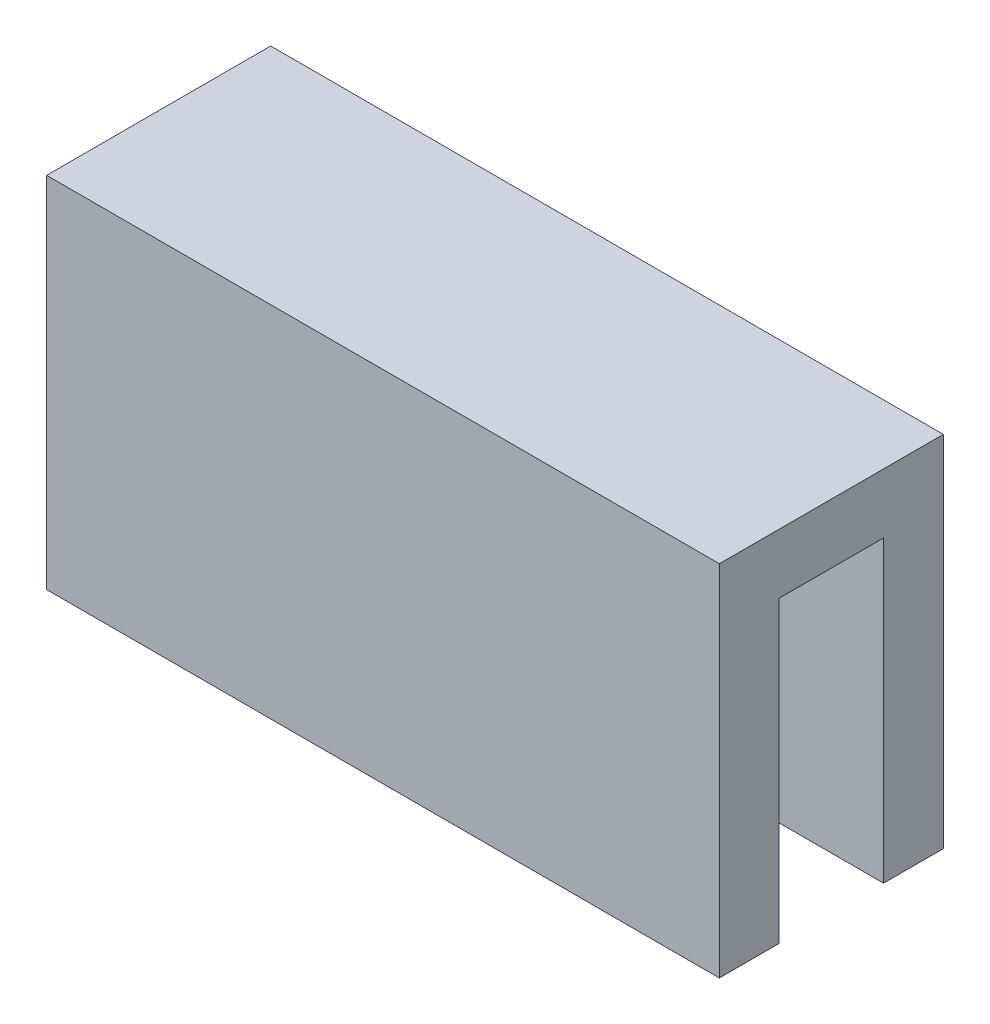
ISO-10303-21;
HEADER;
FILE_DESCRIPTION(('STEP AP214'),'2;1');
FILE_NAME('part.step','',(''),(''),'','','');
FILE_SCHEMA(('AUTOMOTIVE_DESIGN { 1 0 10303 214 1 1 1 1 }'));
ENDSEC;
DATA;
#1=APPLICATION_CONTEXT('core data for automotive mechanical design processes');
#2=APPLICATION_PROTOCOL_DEFINITION('international standard','automotive_design',2000,#1);
#3=PRODUCT_CONTEXT('',#1,'mechanical');
#4=PRODUCT('Part','Part','',(#3));
#5=PRODUCT_RELATED_PRODUCT_CATEGORY('part','',(#4));
#6=PRODUCT_DEFINITION_FORMATION('','',#4);
#7=PRODUCT_DEFINITION_CONTEXT('part definition',#1,'design');
#8=PRODUCT_DEFINITION('design','',#6,#7);
#9=PRODUCT_DEFINITION_SHAPE('','',#8);
#10=(LENGTH_UNIT() NAMED_UNIT(*) SI_UNIT(.MILLI.,.METRE.));
#11=(NAMED_UNIT(*) PLANE_ANGLE_UNIT() SI_UNIT($,.RADIAN.));
#12=(NAMED_UNIT(*) SI_UNIT($,.STERADIAN.) SOLID_ANGLE_UNIT());
#13=UNCERTAINTY_MEASURE_WITH_UNIT(LENGTH_MEASURE(1.E-05),#10,'distance_accuracy_value','');
#14=(GEOMETRIC_REPRESENTATION_CONTEXT(3) GLOBAL_UNCERTAINTY_ASSIGNED_CONTEXT((#13)) GLOBAL_UNIT_ASSIGNED_CONTEXT((#10,
#11,#12)) REPRESENTATION_CONTEXT('',''));
#15=CARTESIAN_POINT('',(0.,0.,0.));
#16=DIRECTION('',(0.,0.,1.));
#17=DIRECTION('',(1.,0.,0.));
#18=AXIS2_PLACEMENT_3D('',#15,#16,#17);
#19=CARTESIAN_POINT('',(18.,-16.,5.994));
#20=DIRECTION('',(0.,1.,0.));
#21=DIRECTION('',(-1.,0.,0.));
#22=AXIS2_PLACEMENT_3D('',#19,#20,#21);
#23=PLANE('',#22);
#24=DIRECTION('',(1.,0.,0.));
#25=VECTOR('',#24,1.);
#26=CARTESIAN_POINT('',(-18.,-16.,2.794));
#27=LINE('',#26,#25);
#28=CARTESIAN_POINT('',(-18.,-16.,2.794));
#29=VERTEX_POINT('',#28);
#30=CARTESIAN_POINT('',(18.,-16.,2.794));
#31=VERTEX_POINT('',#30);
#32=EDGE_CURVE('E171',#29,#31,#27,.T.);
#33=ORIENTED_EDGE('',*,*,#32,.T.);
#34=DIRECTION('',(0.,0.,-1.));
#35=VECTOR('',#34,1.);
#36=CARTESIAN_POINT('',(18.,-16.,5.994));
#37=LINE('',#36,#35);
#38=CARTESIAN_POINT('',(18.,-16.,5.994));
#39=VERTEX_POINT('',#38);
#40=EDGE_CURVE('E140',#39,#31,#37,.T.);
#41=ORIENTED_EDGE('',*,*,#40,.F.);
#42=DIRECTION('',(1.,0.,0.));
#43=VECTOR('',#42,1.);
#44=CARTESIAN_POINT('',(18.,-16.,5.994));
#45=LINE('',#44,#43);
#46=CARTESIAN_POINT('',(-18.,-16.,5.994));
#47=VERTEX_POINT('',#46);
#48=EDGE_CURVE('E65',#47,#39,#45,.T.);
#49=ORIENTED_EDGE('',*,*,#48,.F.);
#50=DIRECTION('',(0.,0.,-1.));
#51=VECTOR('',#50,1.);
#52=CARTESIAN_POINT('',(-18.,-16.,5.994));
#53=LINE('',#52,#51);
#54=EDGE_CURVE('E139',#47,#29,#53,.T.);
#55=ORIENTED_EDGE('',*,*,#54,.T.);
#56=EDGE_LOOP('',(#33,#41,#49,#55));
#57=FACE_BOUND('',#56,.T.);
#58=ADVANCED_FACE('F41',(#57),#23,.F.);
#59=CARTESIAN_POINT('',(18.,3.2,5.994));
#60=DIRECTION('',(-1.,0.,0.));
#61=DIRECTION('',(0.,-1.,0.));
#62=AXIS2_PLACEMENT_3D('',#59,#60,#61);
#63=PLANE('',#62);
#64=DIRECTION('',(0.,0.,1.));
#65=VECTOR('',#64,1.);
#66=CARTESIAN_POINT('',(18.,0.,-2.794));
#67=LINE('',#66,#65);
#68=CARTESIAN_POINT('',(18.,0.,-2.794));
#69=VERTEX_POINT('',#68);
#70=CARTESIAN_POINT('',(18.,0.,2.794));
#71=VERTEX_POINT('',#70);
#72=EDGE_CURVE('E165',#69,#71,#67,.T.);
#73=ORIENTED_EDGE('',*,*,#72,.F.);
#74=DIRECTION('',(0.,1.,0.));
#75=VECTOR('',#74,1.);
#76=CARTESIAN_POINT('',(18.,-16.,-2.794));
#77=LINE('',#76,#75);
#78=CARTESIAN_POINT('',(18.,-16.,-2.794));
#79=VERTEX_POINT('',#78);
#80=EDGE_CURVE('E132',#79,#69,#77,.T.);
#81=ORIENTED_EDGE('',*,*,#80,.F.);
#82=CARTESIAN_POINT('',(18.,-16.,-5.994));
#83=VERTEX_POINT('',#82);
#84=EDGE_CURVE('E87',#79,#83,#37,.T.);
#85=ORIENTED_EDGE('',*,*,#84,.T.);
#86=DIRECTION('',(0.,1.,0.));
#87=VECTOR('',#86,1.);
#88=CARTESIAN_POINT('',(18.,3.2,-5.994));
#89=LINE('',#88,#87);
#90=CARTESIAN_POINT('',(18.,3.2,-5.994));
#91=VERTEX_POINT('',#90);
#92=EDGE_CURVE('E156',#83,#91,#89,.T.);
#93=ORIENTED_EDGE('',*,*,#92,.T.);
#94=DIRECTION('',(0.,0.,-1.));
#95=VECTOR('',#94,1.);
#96=CARTESIAN_POINT('',(18.,3.2,5.994));
#97=LINE('',#96,#95);
#98=CARTESIAN_POINT('',(18.,3.2,5.994));
#99=VERTEX_POINT('',#98);
#100=EDGE_CURVE('E11',#99,#91,#97,.T.);
#101=ORIENTED_EDGE('',*,*,#100,.F.);
#102=DIRECTION('',(0.,1.,0.));
#103=VECTOR('',#102,1.);
#104=CARTESIAN_POINT('',(18.,3.2,5.994));
#105=LINE('',#104,#103);
#106=EDGE_CURVE('E155',#39,#99,#105,.T.);
#107=ORIENTED_EDGE('',*,*,#106,.F.);
#108=ORIENTED_EDGE('',*,*,#40,.T.);
#109=DIRECTION('',(0.,1.,0.));
#110=VECTOR('',#109,1.);
#111=CARTESIAN_POINT('',(18.,-16.,2.794));
#112=LINE('',#111,#110);
#113=EDGE_CURVE('E56',#31,#71,#112,.T.);
#114=ORIENTED_EDGE('',*,*,#113,.T.);
#115=EDGE_LOOP('',(#73,#81,#85,#93,#101,#107,#108,#114));
#116=FACE_BOUND('',#115,.T.);
#117=ADVANCED_FACE('F43',(#116),#63,.F.);
#118=CARTESIAN_POINT('',(18.,3.2,5.994));
#119=DIRECTION('',(0.,-1.,0.));
#120=DIRECTION('',(1.,0.,0.));
#121=AXIS2_PLACEMENT_3D('',#118,#119,#120);
#122=PLANE('',#121);
#123=DIRECTION('',(-1.,0.,0.));
#124=VECTOR('',#123,1.);
#125=CARTESIAN_POINT('',(18.,3.2,-5.994));
#126=LINE('',#125,#124);
#127=CARTESIAN_POINT('',(-18.,3.19999999999999,-5.994));
#128=VERTEX_POINT('',#127);
#129=EDGE_CURVE('E152',#91,#128,#126,.T.);
#130=ORIENTED_EDGE('',*,*,#129,.T.);
#131=DIRECTION('',(0.,0.,-1.));
#132=VECTOR('',#131,1.);
#133=CARTESIAN_POINT('',(-18.,3.19999999999999,5.994));
#134=LINE('',#133,#132);
#135=CARTESIAN_POINT('',(-18.,3.19999999999999,5.994));
#136=VERTEX_POINT('',#135);
#137=EDGE_CURVE('E49',#136,#128,#134,.T.);
#138=ORIENTED_EDGE('',*,*,#137,.F.);
#139=DIRECTION('',(-1.,0.,0.));
#140=VECTOR('',#139,1.);
#141=CARTESIAN_POINT('',(18.,3.2,5.994));
#142=LINE('',#141,#140);
#143=EDGE_CURVE('E94',#99,#136,#142,.T.);
#144=ORIENTED_EDGE('',*,*,#143,.F.);
#145=ORIENTED_EDGE('',*,*,#100,.T.);
#146=EDGE_LOOP('',(#130,#138,#144,#145));
#147=FACE_BOUND('',#146,.T.);
#148=ADVANCED_FACE('F220',(#147),#122,.F.);
#149=CARTESIAN_POINT('',(-18.,3.19999999999999,5.994));
#150=DIRECTION('',(1.,0.,0.));
#151=DIRECTION('',(0.,1.,0.));
#152=AXIS2_PLACEMENT_3D('',#149,#150,#151);
#153=PLANE('',#152);
#154=CARTESIAN_POINT('',(-18.,-16.,-2.794));
#155=VERTEX_POINT('',#154);
#156=CARTESIAN_POINT('',(-18.,-16.,-5.994));
#157=VERTEX_POINT('',#156);
#158=EDGE_CURVE('E130',#155,#157,#53,.T.);
#159=ORIENTED_EDGE('',*,*,#158,.F.);
#160=DIRECTION('',(0.,-1.,0.));
#161=VECTOR('',#160,1.);
#162=CARTESIAN_POINT('',(-18.,-16.,-2.794));
#163=LINE('',#162,#161);
#164=CARTESIAN_POINT('',(-18.,0.,-2.794));
#165=VERTEX_POINT('',#164);
#166=EDGE_CURVE('E117',#165,#155,#163,.T.);
#167=ORIENTED_EDGE('',*,*,#166,.F.);
#168=DIRECTION('',(0.,0.,1.));
#169=VECTOR('',#168,1.);
#170=CARTESIAN_POINT('',(-18.,0.,-2.794));
#171=LINE('',#170,#169);
#172=CARTESIAN_POINT('',(-18.,0.,2.794));
#173=VERTEX_POINT('',#172);
#174=EDGE_CURVE('E160',#165,#173,#171,.T.);
#175=ORIENTED_EDGE('',*,*,#174,.T.);
#176=DIRECTION('',(0.,-1.,0.));
#177=VECTOR('',#176,1.);
#178=CARTESIAN_POINT('',(-18.,-16.,2.794));
#179=LINE('',#178,#177);
#180=EDGE_CURVE('E173',#173,#29,#179,.T.);
#181=ORIENTED_EDGE('',*,*,#180,.T.);
#182=ORIENTED_EDGE('',*,*,#54,.F.);
#183=DIRECTION('',(0.,-1.,0.));
#184=VECTOR('',#183,1.);
#185=CARTESIAN_POINT('',(-18.,3.19999999999999,5.994));
#186=LINE('',#185,#184);
#187=EDGE_CURVE('E148',#136,#47,#186,.T.);
#188=ORIENTED_EDGE('',*,*,#187,.F.);
#189=ORIENTED_EDGE('',*,*,#137,.T.);
#190=DIRECTION('',(0.,-1.,0.));
#191=VECTOR('',#190,1.);
#192=CARTESIAN_POINT('',(-18.,3.19999999999999,-5.994));
#193=LINE('',#192,#191);
#194=EDGE_CURVE('E137',#128,#157,#193,.T.);
#195=ORIENTED_EDGE('',*,*,#194,.T.);
#196=EDGE_LOOP('',(#159,#167,#175,#181,#182,#188,#189,#195));
#197=FACE_BOUND('',#196,.T.);
#198=ADVANCED_FACE('F134',(#197),#153,.F.);
#199=ORIENTED_EDGE('',*,*,#84,.F.);
#200=DIRECTION('',(1.,0.,0.));
#201=VECTOR('',#200,1.);
#202=CARTESIAN_POINT('',(-18.,-16.,-2.794));
#203=LINE('',#202,#201);
#204=EDGE_CURVE('E120',#155,#79,#203,.T.);
#205=ORIENTED_EDGE('',*,*,#204,.F.);
#206=ORIENTED_EDGE('',*,*,#158,.T.);
#207=DIRECTION('',(1.,0.,0.));
#208=VECTOR('',#207,1.);
#209=CARTESIAN_POINT('',(18.,-16.,-5.994));
#210=LINE('',#209,#208);
#211=EDGE_CURVE('E153',#157,#83,#210,.T.);
#212=ORIENTED_EDGE('',*,*,#211,.T.);
#213=EDGE_LOOP('',(#199,#205,#206,#212));
#214=FACE_BOUND('',#213,.T.);
#215=ADVANCED_FACE('F129',(#214),#23,.F.);
#216=CARTESIAN_POINT('',(0.,0.,5.994));
#217=DIRECTION('',(0.,0.,-1.));
#218=DIRECTION('',(-1.,0.,0.));
#219=AXIS2_PLACEMENT_3D('',#216,#217,#218);
#220=PLANE('',#219);
#221=ORIENTED_EDGE('',*,*,#106,.T.);
#222=ORIENTED_EDGE('',*,*,#143,.T.);
#223=ORIENTED_EDGE('',*,*,#187,.T.);
#224=ORIENTED_EDGE('',*,*,#48,.T.);
#225=EDGE_LOOP('',(#221,#222,#223,#224));
#226=FACE_BOUND('',#225,.T.);
#227=ADVANCED_FACE('F224',(#226),#220,.F.);
#228=CARTESIAN_POINT('',(0.,0.,-5.994));
#229=DIRECTION('',(0.,0.,-1.));
#230=DIRECTION('',(-1.,0.,0.));
#231=AXIS2_PLACEMENT_3D('',#228,#229,#230);
#232=PLANE('',#231);
#233=CARTESIAN_POINT('',(11.7,-1.7,-5.994));
#234=DIRECTION('',(0.,0.,1.));
#235=DIRECTION('',(1.,0.,0.));
#236=AXIS2_PLACEMENT_3D('',#233,#234,#235);
#237=CIRCLE('',#236,3.3);
#238=CARTESIAN_POINT('',(15.,-1.7,-5.994));
#239=VERTEX_POINT('',#238);
#240=EDGE_CURVE('E197',#239,#239,#237,.T.);
#241=ORIENTED_EDGE('',*,*,#240,.T.);
#242=EDGE_LOOP('',(#241));
#243=FACE_BOUND('',#242,.T.);
#244=CARTESIAN_POINT('',(3.9,-1.70000000000006,-5.994));
#245=DIRECTION('',(0.,0.,1.));
#246=DIRECTION('',(1.,0.,0.));
#247=AXIS2_PLACEMENT_3D('',#244,#245,#246);
#248=CIRCLE('',#247,3.3);
#249=CARTESIAN_POINT('',(7.2,-1.70000000000006,-5.994));
#250=VERTEX_POINT('',#249);
#251=EDGE_CURVE('E194',#250,#250,#248,.T.);
#252=ORIENTED_EDGE('',*,*,#251,.T.);
#253=EDGE_LOOP('',(#252));
#254=FACE_BOUND('',#253,.T.);
#255=CARTESIAN_POINT('',(-3.9,-1.70000000000011,-5.994));
#256=DIRECTION('',(0.,0.,1.));
#257=DIRECTION('',(1.,0.,0.));
#258=AXIS2_PLACEMENT_3D('',#255,#256,#257);
#259=CIRCLE('',#258,3.3);
#260=CARTESIAN_POINT('',(-0.599999999999998,-1.70000000000011,-5.994));
#261=VERTEX_POINT('',#260);
#262=EDGE_CURVE('E188',#261,#261,#259,.T.);
#263=ORIENTED_EDGE('',*,*,#262,.T.);
#264=EDGE_LOOP('',(#263));
#265=FACE_BOUND('',#264,.T.);
#266=CARTESIAN_POINT('',(-11.7,-1.70000000000016,-5.994));
#267=DIRECTION('',(0.,0.,1.));
#268=DIRECTION('',(1.,0.,0.));
#269=AXIS2_PLACEMENT_3D('',#266,#267,#268);
#270=CIRCLE('',#269,3.3);
#271=CARTESIAN_POINT('',(-8.4,-1.70000000000016,-5.994));
#272=VERTEX_POINT('',#271);
#273=EDGE_CURVE('E182',#272,#272,#270,.T.);
#274=ORIENTED_EDGE('',*,*,#273,.T.);
#275=EDGE_LOOP('',(#274));
#276=FACE_BOUND('',#275,.T.);
#277=ORIENTED_EDGE('',*,*,#92,.F.);
#278=ORIENTED_EDGE('',*,*,#211,.F.);
#279=ORIENTED_EDGE('',*,*,#194,.F.);
#280=ORIENTED_EDGE('',*,*,#129,.F.);
#281=EDGE_LOOP('',(#277,#278,#279,#280));
#282=FACE_BOUND('',#281,.T.);
#283=ADVANCED_FACE('F151',(#243,#254,#265,#276,#282),#232,.T.);
#284=CARTESIAN_POINT('',(-18.,0.,-2.794));
#285=DIRECTION('',(0.,1.,0.));
#286=DIRECTION('',(0.,0.,1.));
#287=AXIS2_PLACEMENT_3D('',#284,#285,#286);
#288=PLANE('',#287);
#289=DIRECTION('',(-1.,0.,0.));
#290=VECTOR('',#289,1.);
#291=CARTESIAN_POINT('',(-18.,0.,2.794));
#292=LINE('',#291,#290);
#293=EDGE_CURVE('E126',#71,#173,#292,.T.);
#294=ORIENTED_EDGE('',*,*,#293,.T.);
#295=ORIENTED_EDGE('',*,*,#174,.F.);
#296=DIRECTION('',(-1.,0.,0.));
#297=VECTOR('',#296,1.);
#298=CARTESIAN_POINT('',(-18.,0.,-2.794));
#299=LINE('',#298,#297);
#300=EDGE_CURVE('E122',#69,#165,#299,.T.);
#301=ORIENTED_EDGE('',*,*,#300,.F.);
#302=ORIENTED_EDGE('',*,*,#72,.T.);
#303=EDGE_LOOP('',(#294,#295,#301,#302));
#304=FACE_BOUND('',#303,.T.);
#305=ADVANCED_FACE('F239',(#304),#288,.F.);
#306=CARTESIAN_POINT('',(0.,0.,-2.794));
#307=DIRECTION('',(0.,0.,-1.));
#308=DIRECTION('',(-1.,0.,0.));
#309=AXIS2_PLACEMENT_3D('',#306,#307,#308);
#310=PLANE('',#309);
#311=ORIENTED_EDGE('',*,*,#166,.T.);
#312=ORIENTED_EDGE('',*,*,#204,.T.);
#313=ORIENTED_EDGE('',*,*,#80,.T.);
#314=ORIENTED_EDGE('',*,*,#300,.T.);
#315=EDGE_LOOP('',(#311,#312,#313,#314));
#316=FACE_BOUND('',#315,.T.);
#317=ADVANCED_FACE('F119',(#316),#310,.F.);
#318=CARTESIAN_POINT('',(0.,0.,2.794));
#319=DIRECTION('',(0.,0.,-1.));
#320=DIRECTION('',(-1.,0.,0.));
#321=AXIS2_PLACEMENT_3D('',#318,#319,#320);
#322=PLANE('',#321);
#323=ORIENTED_EDGE('',*,*,#180,.F.);
#324=ORIENTED_EDGE('',*,*,#293,.F.);
#325=ORIENTED_EDGE('',*,*,#113,.F.);
#326=ORIENTED_EDGE('',*,*,#32,.F.);
#327=EDGE_LOOP('',(#323,#324,#325,#326));
#328=FACE_BOUND('',#327,.T.);
#329=ADVANCED_FACE('F240',(#328),#322,.T.);
#330=CARTESIAN_POINT('',(-11.7,-1.70000000000016,-3.394));
#331=DIRECTION('',(0.,0.,-1.));
#332=DIRECTION('',(-1.,0.,0.));
#333=AXIS2_PLACEMENT_3D('',#330,#331,#332);
#334=CYLINDRICAL_SURFACE('',#333,3.3);
#335=CARTESIAN_POINT('',(-11.7,-1.70000000000016,-3.394));
#336=DIRECTION('',(0.,0.,1.));
#337=DIRECTION('',(1.,0.,0.));
#338=AXIS2_PLACEMENT_3D('',#335,#336,#337);
#339=CIRCLE('',#338,3.3);
#340=CARTESIAN_POINT('',(-8.4,-1.70000000000016,-3.394));
#341=VERTEX_POINT('',#340);
#342=EDGE_CURVE('E179',#341,#341,#339,.T.);
#343=ORIENTED_EDGE('',*,*,#342,.T.);
#344=EDGE_LOOP('',(#343));
#345=FACE_BOUND('',#344,.T.);
#346=ORIENTED_EDGE('',*,*,#273,.F.);
#347=EDGE_LOOP('',(#346));
#348=FACE_BOUND('',#347,.T.);
#349=ADVANCED_FACE('F242',(#345,#348),#334,.F.);
#350=CARTESIAN_POINT('',(-11.7,-1.70000000000016,-3.394));
#351=DIRECTION('',(0.,0.,1.));
#352=DIRECTION('',(1.,0.,0.));
#353=AXIS2_PLACEMENT_3D('',#350,#351,#352);
#354=PLANE('',#353);
#355=ORIENTED_EDGE('',*,*,#342,.F.);
#356=EDGE_LOOP('',(#355));
#357=FACE_BOUND('',#356,.T.);
#358=ADVANCED_FACE('F248',(#357),#354,.F.);
#359=CARTESIAN_POINT('',(-3.9,-1.70000000000011,-3.394));
#360=DIRECTION('',(0.,0.,-1.));
#361=DIRECTION('',(-1.,0.,0.));
#362=AXIS2_PLACEMENT_3D('',#359,#360,#361);
#363=CYLINDRICAL_SURFACE('',#362,3.3);
#364=CARTESIAN_POINT('',(-3.9,-1.70000000000011,-3.394));
#365=DIRECTION('',(0.,0.,1.));
#366=DIRECTION('',(1.,0.,0.));
#367=AXIS2_PLACEMENT_3D('',#364,#365,#366);
#368=CIRCLE('',#367,3.3);
#369=CARTESIAN_POINT('',(-0.599999999999998,-1.70000000000011,-3.394));
#370=VERTEX_POINT('',#369);
#371=EDGE_CURVE('E185',#370,#370,#368,.T.);
#372=ORIENTED_EDGE('',*,*,#371,.T.);
#373=EDGE_LOOP('',(#372));
#374=FACE_BOUND('',#373,.T.);
#375=ORIENTED_EDGE('',*,*,#262,.F.);
#376=EDGE_LOOP('',(#375));
#377=FACE_BOUND('',#376,.T.);
#378=ADVANCED_FACE('F268',(#374,#377),#363,.F.);
#379=CARTESIAN_POINT('',(-3.9,-1.70000000000011,-3.394));
#380=DIRECTION('',(0.,0.,1.));
#381=DIRECTION('',(1.,0.,0.));
#382=AXIS2_PLACEMENT_3D('',#379,#380,#381);
#383=PLANE('',#382);
#384=ORIENTED_EDGE('',*,*,#371,.F.);
#385=EDGE_LOOP('',(#384));
#386=FACE_BOUND('',#385,.T.);
#387=ADVANCED_FACE('F270',(#386),#383,.F.);
#388=CARTESIAN_POINT('',(3.9,-1.70000000000006,-3.394));
#389=DIRECTION('',(0.,0.,-1.));
#390=DIRECTION('',(-1.,0.,0.));
#391=AXIS2_PLACEMENT_3D('',#388,#389,#390);
#392=CYLINDRICAL_SURFACE('',#391,3.3);
#393=CARTESIAN_POINT('',(3.9,-1.70000000000006,-3.394));
#394=DIRECTION('',(0.,0.,1.));
#395=DIRECTION('',(1.,0.,0.));
#396=AXIS2_PLACEMENT_3D('',#393,#394,#395);
#397=CIRCLE('',#396,3.3);
#398=CARTESIAN_POINT('',(7.2,-1.70000000000006,-3.394));
#399=VERTEX_POINT('',#398);
#400=EDGE_CURVE('E191',#399,#399,#397,.T.);
#401=ORIENTED_EDGE('',*,*,#400,.T.);
#402=EDGE_LOOP('',(#401));
#403=FACE_BOUND('',#402,.T.);
#404=ORIENTED_EDGE('',*,*,#251,.F.);
#405=EDGE_LOOP('',(#404));
#406=FACE_BOUND('',#405,.T.);
#407=ADVANCED_FACE('F277',(#403,#406),#392,.F.);
#408=CARTESIAN_POINT('',(3.9,-1.70000000000006,-3.394));
#409=DIRECTION('',(0.,0.,1.));
#410=DIRECTION('',(1.,0.,0.));
#411=AXIS2_PLACEMENT_3D('',#408,#409,#410);
#412=PLANE('',#411);
#413=ORIENTED_EDGE('',*,*,#400,.F.);
#414=EDGE_LOOP('',(#413));
#415=FACE_BOUND('',#414,.T.);
#416=ADVANCED_FACE('F212',(#415),#412,.F.);
#417=CARTESIAN_POINT('',(11.7,-1.7,-3.394));
#418=DIRECTION('',(0.,0.,-1.));
#419=DIRECTION('',(-1.,0.,0.));
#420=AXIS2_PLACEMENT_3D('',#417,#418,#419);
#421=CYLINDRICAL_SURFACE('',#420,3.3);
#422=CARTESIAN_POINT('',(11.7,-1.7,-3.394));
#423=DIRECTION('',(0.,0.,1.));
#424=DIRECTION('',(1.,0.,0.));
#425=AXIS2_PLACEMENT_3D('',#422,#423,#424);
#426=CIRCLE('',#425,3.3);
#427=CARTESIAN_POINT('',(15.,-1.7,-3.394));
#428=VERTEX_POINT('',#427);
#429=EDGE_CURVE('E176',#428,#428,#426,.T.);
#430=ORIENTED_EDGE('',*,*,#429,.T.);
#431=EDGE_LOOP('',(#430));
#432=FACE_BOUND('',#431,.T.);
#433=ORIENTED_EDGE('',*,*,#240,.F.);
#434=EDGE_LOOP('',(#433));
#435=FACE_BOUND('',#434,.T.);
#436=ADVANCED_FACE('F203',(#432,#435),#421,.F.);
#437=CARTESIAN_POINT('',(11.7,-1.7,-3.394));
#438=DIRECTION('',(0.,0.,1.));
#439=DIRECTION('',(1.,0.,0.));
#440=AXIS2_PLACEMENT_3D('',#437,#438,#439);
#441=PLANE('',#440);
#442=ORIENTED_EDGE('',*,*,#429,.F.);
#443=EDGE_LOOP('',(#442));
#444=FACE_BOUND('',#443,.T.);
#445=ADVANCED_FACE('F206',(#444),#441,.F.);
#446=CLOSED_SHELL('',(#58,#117,#148,#198,#215,#227,#283,#305,#317,#329,#349,#358,#378,#387,#407,
#416,#436,#445));
#447=MANIFOLD_SOLID_BREP('B2',#446);
#448=ADVANCED_BREP_SHAPE_REPRESENTATION('',(#18,#447),#14);
#449=SHAPE_DEFINITION_REPRESENTATION(#9,#448);
ENDSEC;
END-ISO-10303-21;
